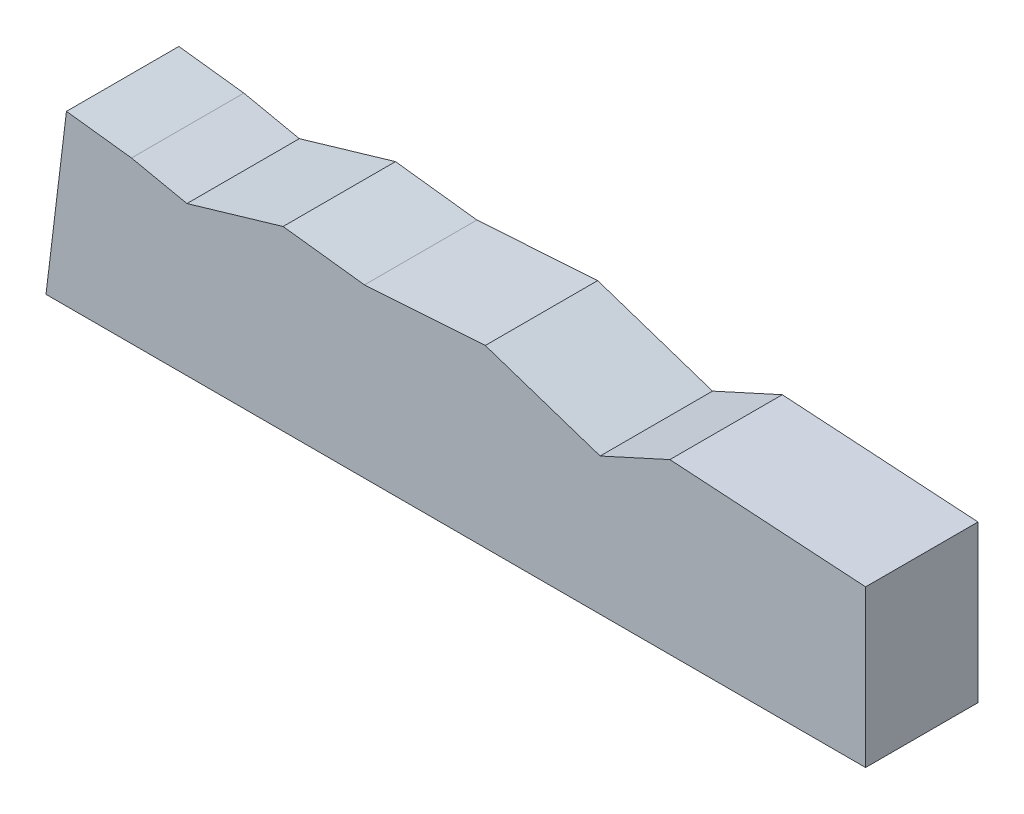
ISO-10303-21;
HEADER;
FILE_DESCRIPTION(('STEP AP214'),'2;1');
FILE_NAME('part.step','',(''),(''),'','','');
FILE_SCHEMA(('AUTOMOTIVE_DESIGN { 1 0 10303 214 1 1 1 1 }'));
ENDSEC;
DATA;
#1=APPLICATION_CONTEXT('core data for automotive mechanical design processes');
#2=APPLICATION_PROTOCOL_DEFINITION('international standard','automotive_design',2000,#1);
#3=PRODUCT_CONTEXT('',#1,'mechanical');
#4=PRODUCT('Part','Part','',(#3));
#5=PRODUCT_RELATED_PRODUCT_CATEGORY('part','',(#4));
#6=PRODUCT_DEFINITION_FORMATION('','',#4);
#7=PRODUCT_DEFINITION_CONTEXT('part definition',#1,'design');
#8=PRODUCT_DEFINITION('design','',#6,#7);
#9=PRODUCT_DEFINITION_SHAPE('','',#8);
#10=(LENGTH_UNIT() NAMED_UNIT(*) SI_UNIT(.MILLI.,.METRE.));
#11=(NAMED_UNIT(*) PLANE_ANGLE_UNIT() SI_UNIT($,.RADIAN.));
#12=(NAMED_UNIT(*) SI_UNIT($,.STERADIAN.) SOLID_ANGLE_UNIT());
#13=UNCERTAINTY_MEASURE_WITH_UNIT(LENGTH_MEASURE(1.E-05),#10,'distance_accuracy_value','');
#14=(GEOMETRIC_REPRESENTATION_CONTEXT(3) GLOBAL_UNCERTAINTY_ASSIGNED_CONTEXT((#13)) GLOBAL_UNIT_ASSIGNED_CONTEXT((#10,
#11,#12)) REPRESENTATION_CONTEXT('',''));
#15=CARTESIAN_POINT('',(0.,0.,0.));
#16=DIRECTION('',(0.,0.,1.));
#17=DIRECTION('',(1.,0.,0.));
#18=AXIS2_PLACEMENT_3D('',#15,#16,#17);
#19=CARTESIAN_POINT('',(174.222136921618,-126.856784040929,25.));
#20=DIRECTION('',(-1.,0.,0.));
#21=DIRECTION('',(0.,0.,1.));
#22=AXIS2_PLACEMENT_3D('',#19,#20,#21);
#23=PLANE('',#22);
#24=DIRECTION('',(0.,1.,0.));
#25=VECTOR('',#24,1.);
#26=CARTESIAN_POINT('',(174.222136921618,-126.856784040929,-25.));
#27=LINE('',#26,#25);
#28=CARTESIAN_POINT('',(174.222136921618,-126.856784040929,-25.));
#29=VERTEX_POINT('',#28);
#30=CARTESIAN_POINT('',(174.222136921618,-57.2381283717194,-25.));
#31=VERTEX_POINT('',#30);
#32=EDGE_CURVE('E151',#29,#31,#27,.T.);
#33=ORIENTED_EDGE('',*,*,#32,.T.);
#34=DIRECTION('',(0.,0.,-1.));
#35=VECTOR('',#34,1.);
#36=CARTESIAN_POINT('',(174.222136921618,-57.2381283717194,25.));
#37=LINE('',#36,#35);
#38=CARTESIAN_POINT('',(174.222136921618,-57.2381283717194,25.));
#39=VERTEX_POINT('',#38);
#40=EDGE_CURVE('E11',#39,#31,#37,.T.);
#41=ORIENTED_EDGE('',*,*,#40,.F.);
#42=DIRECTION('',(0.,1.,0.));
#43=VECTOR('',#42,1.);
#44=CARTESIAN_POINT('',(174.222136921618,-126.856784040929,25.));
#45=LINE('',#44,#43);
#46=CARTESIAN_POINT('',(174.222136921618,-126.856784040929,25.));
#47=VERTEX_POINT('',#46);
#48=EDGE_CURVE('E171',#47,#39,#45,.T.);
#49=ORIENTED_EDGE('',*,*,#48,.F.);
#50=DIRECTION('',(0.,0.,-1.));
#51=VECTOR('',#50,1.);
#52=CARTESIAN_POINT('',(174.222136921618,-126.856784040929,25.));
#53=LINE('',#52,#51);
#54=EDGE_CURVE('E147',#47,#29,#53,.T.);
#55=ORIENTED_EDGE('',*,*,#54,.T.);
#56=EDGE_LOOP('',(#33,#41,#49,#55));
#57=FACE_BOUND('',#56,.T.);
#58=ADVANCED_FACE('F37',(#57),#23,.F.);
#59=CARTESIAN_POINT('',(174.222136921618,-57.2381283717194,25.));
#60=DIRECTION('',(-0.062997541398777,-0.998013682159573,0.));
#61=DIRECTION('',(0.998013682159573,-0.062997541398777,0.));
#62=AXIS2_PLACEMENT_3D('',#59,#60,#61);
#63=PLANE('',#62);
#64=DIRECTION('',(-0.998013682159573,0.062997541398777,0.));
#65=VECTOR('',#64,1.);
#66=CARTESIAN_POINT('',(174.222136921618,-57.2381283717194,-25.));
#67=LINE('',#66,#65);
#68=CARTESIAN_POINT('',(87.1568381803844,-51.7423121721066,-25.));
#69=VERTEX_POINT('',#68);
#70=EDGE_CURVE('E154',#31,#69,#67,.T.);
#71=ORIENTED_EDGE('',*,*,#70,.T.);
#72=DIRECTION('',(0.,0.,-1.));
#73=VECTOR('',#72,1.);
#74=CARTESIAN_POINT('',(87.1568381803844,-51.7423121721066,25.));
#75=LINE('',#74,#73);
#76=CARTESIAN_POINT('',(87.1568381803844,-51.7423121721066,25.));
#77=VERTEX_POINT('',#76);
#78=EDGE_CURVE('E45',#77,#69,#75,.T.);
#79=ORIENTED_EDGE('',*,*,#78,.F.);
#80=DIRECTION('',(-0.998013682159573,0.062997541398777,0.));
#81=VECTOR('',#80,1.);
#82=CARTESIAN_POINT('',(174.222136921618,-57.2381283717194,25.));
#83=LINE('',#82,#81);
#84=EDGE_CURVE('E105',#39,#77,#83,.T.);
#85=ORIENTED_EDGE('',*,*,#84,.F.);
#86=ORIENTED_EDGE('',*,*,#40,.T.);
#87=EDGE_LOOP('',(#71,#79,#85,#86));
#88=FACE_BOUND('',#87,.T.);
#89=ADVANCED_FACE('F243',(#88),#63,.F.);
#90=CARTESIAN_POINT('',(87.1568381803844,-51.7423121721066,25.));
#91=DIRECTION('',(0.414481700405183,-0.910057646541816,0.));
#92=DIRECTION('',(0.910057646541816,0.414481700405183,0.));
#93=AXIS2_PLACEMENT_3D('',#90,#91,#92);
#94=PLANE('',#93);
#95=DIRECTION('',(-0.910057646541816,-0.414481700405183,0.));
#96=VECTOR('',#95,1.);
#97=CARTESIAN_POINT('',(87.1568381803844,-51.7423121721066,-25.));
#98=LINE('',#97,#96);
#99=CARTESIAN_POINT('',(56.1352863683343,-65.87093973007,-25.));
#100=VERTEX_POINT('',#99);
#101=EDGE_CURVE('E156',#69,#100,#98,.T.);
#102=ORIENTED_EDGE('',*,*,#101,.T.);
#103=DIRECTION('',(0.,0.,-1.));
#104=VECTOR('',#103,1.);
#105=CARTESIAN_POINT('',(56.1352863683343,-65.87093973007,25.));
#106=LINE('',#105,#104);
#107=CARTESIAN_POINT('',(56.1352863683343,-65.87093973007,25.));
#108=VERTEX_POINT('',#107);
#109=EDGE_CURVE('E187',#108,#100,#106,.T.);
#110=ORIENTED_EDGE('',*,*,#109,.F.);
#111=DIRECTION('',(-0.910057646541816,-0.414481700405183,0.));
#112=VECTOR('',#111,1.);
#113=CARTESIAN_POINT('',(87.1568381803844,-51.7423121721066,25.));
#114=LINE('',#113,#112);
#115=EDGE_CURVE('E195',#77,#108,#114,.T.);
#116=ORIENTED_EDGE('',*,*,#115,.F.);
#117=ORIENTED_EDGE('',*,*,#78,.T.);
#118=EDGE_LOOP('',(#102,#110,#116,#117));
#119=FACE_BOUND('',#118,.T.);
#120=ADVANCED_FACE('F193',(#119),#94,.F.);
#121=CARTESIAN_POINT('',(56.1352863683343,-65.87093973007,25.));
#122=DIRECTION('',(-0.316227766016838,-0.948683298050514,0.));
#123=DIRECTION('',(0.948683298050514,-0.316227766016838,0.));
#124=AXIS2_PLACEMENT_3D('',#121,#122,#123);
#125=PLANE('',#124);
#126=DIRECTION('',(-0.948683298050514,0.316227766016838,0.));
#127=VECTOR('',#126,1.);
#128=CARTESIAN_POINT('',(56.1352863683343,-65.87093973007,-25.));
#129=LINE('',#128,#127);
#130=CARTESIAN_POINT('',(5.04231824238954,-48.8399503547551,-25.));
#131=VERTEX_POINT('',#130);
#132=EDGE_CURVE('E158',#100,#131,#129,.T.);
#133=ORIENTED_EDGE('',*,*,#132,.T.);
#134=DIRECTION('',(0.,0.,-1.));
#135=VECTOR('',#134,1.);
#136=CARTESIAN_POINT('',(5.04231824238954,-48.8399503547551,25.));
#137=LINE('',#136,#135);
#138=CARTESIAN_POINT('',(5.04231824238954,-48.8399503547551,25.));
#139=VERTEX_POINT('',#138);
#140=EDGE_CURVE('E184',#139,#131,#137,.T.);
#141=ORIENTED_EDGE('',*,*,#140,.F.);
#142=DIRECTION('',(-0.948683298050514,0.316227766016838,0.));
#143=VECTOR('',#142,1.);
#144=CARTESIAN_POINT('',(56.1352863683343,-65.87093973007,25.));
#145=LINE('',#144,#143);
#146=EDGE_CURVE('E213',#108,#139,#145,.T.);
#147=ORIENTED_EDGE('',*,*,#146,.F.);
#148=ORIENTED_EDGE('',*,*,#109,.T.);
#149=EDGE_LOOP('',(#133,#141,#147,#148));
#150=FACE_BOUND('',#149,.T.);
#151=ADVANCED_FACE('F204',(#150),#125,.F.);
#152=CARTESIAN_POINT('',(5.04231824238954,-48.8399503547551,25.));
#153=DIRECTION('',(0.0654332425606763,-0.997856949050311,0.));
#154=DIRECTION('',(0.997856949050311,0.0654332425606763,0.));
#155=AXIS2_PLACEMENT_3D('',#152,#153,#154);
#156=PLANE('',#155);
#157=DIRECTION('',(-0.997856949050311,-0.0654332425606763,0.));
#158=VECTOR('',#157,1.);
#159=CARTESIAN_POINT('',(5.04231824238954,-48.8399503547551,-25.));
#160=LINE('',#159,#158);
#161=CARTESIAN_POINT('',(-48.6933896142075,-52.3636033289582,-25.));
#162=VERTEX_POINT('',#161);
#163=EDGE_CURVE('E160',#131,#162,#160,.T.);
#164=ORIENTED_EDGE('',*,*,#163,.T.);
#165=DIRECTION('',(0.,0.,-1.));
#166=VECTOR('',#165,1.);
#167=CARTESIAN_POINT('',(-48.6933896142075,-52.3636033289582,25.));
#168=LINE('',#167,#166);
#169=CARTESIAN_POINT('',(-48.6933896142075,-52.3636033289582,25.));
#170=VERTEX_POINT('',#169);
#171=EDGE_CURVE('E181',#170,#162,#168,.T.);
#172=ORIENTED_EDGE('',*,*,#171,.F.);
#173=DIRECTION('',(-0.997856949050311,-0.0654332425606763,0.));
#174=VECTOR('',#173,1.);
#175=CARTESIAN_POINT('',(5.04231824238954,-48.8399503547551,25.));
#176=LINE('',#175,#174);
#177=EDGE_CURVE('E210',#139,#170,#176,.T.);
#178=ORIENTED_EDGE('',*,*,#177,.F.);
#179=ORIENTED_EDGE('',*,*,#140,.T.);
#180=EDGE_LOOP('',(#164,#172,#178,#179));
#181=FACE_BOUND('',#180,.T.);
#182=ADVANCED_FACE('F208',(#181),#156,.F.);
#183=CARTESIAN_POINT('',(-48.6933896142075,-52.3636033289582,25.));
#184=DIRECTION('',(-0.120331367519238,-0.992733782033708,0.));
#185=DIRECTION('',(0.992733782033708,-0.120331367519238,0.));
#186=AXIS2_PLACEMENT_3D('',#183,#184,#185);
#187=PLANE('',#186);
#188=DIRECTION('',(-0.992733782033708,0.120331367519238,0.));
#189=VECTOR('',#188,1.);
#190=CARTESIAN_POINT('',(-48.6933896142075,-52.3636033289582,-25.));
#191=LINE('',#190,#189);
#192=CARTESIAN_POINT('',(-84.9091169106755,-47.9738182021136,-25.));
#193=VERTEX_POINT('',#192);
#194=EDGE_CURVE('E162',#162,#193,#191,.T.);
#195=ORIENTED_EDGE('',*,*,#194,.T.);
#196=DIRECTION('',(0.,0.,-1.));
#197=VECTOR('',#196,1.);
#198=CARTESIAN_POINT('',(-84.9091169106755,-47.9738182021136,25.));
#199=LINE('',#198,#197);
#200=CARTESIAN_POINT('',(-84.9091169106755,-47.9738182021136,25.));
#201=VERTEX_POINT('',#200);
#202=EDGE_CURVE('E178',#201,#193,#199,.T.);
#203=ORIENTED_EDGE('',*,*,#202,.F.);
#204=DIRECTION('',(-0.992733782033708,0.120331367519238,0.));
#205=VECTOR('',#204,1.);
#206=CARTESIAN_POINT('',(-48.6933896142075,-52.3636033289582,25.));
#207=LINE('',#206,#205);
#208=EDGE_CURVE('E212',#170,#201,#207,.T.);
#209=ORIENTED_EDGE('',*,*,#208,.F.);
#210=ORIENTED_EDGE('',*,*,#171,.T.);
#211=EDGE_LOOP('',(#195,#203,#209,#210));
#212=FACE_BOUND('',#211,.T.);
#213=ADVANCED_FACE('F256',(#212),#187,.F.);
#214=CARTESIAN_POINT('',(-84.9091169106755,-47.9738182021136,25.));
#215=DIRECTION('',(0.281473567950709,-0.959568981650146,0.));
#216=DIRECTION('',(0.959568981650146,0.281473567950709,0.));
#217=AXIS2_PLACEMENT_3D('',#214,#215,#216);
#218=PLANE('',#217);
#219=DIRECTION('',(-0.959568981650146,-0.281473567950709,0.));
#220=VECTOR('',#219,1.);
#221=CARTESIAN_POINT('',(-84.9091169106755,-47.9738182021136,-25.));
#222=LINE('',#221,#220);
#223=CARTESIAN_POINT('',(-127.67636539161,-60.5188777565209,-25.));
#224=VERTEX_POINT('',#223);
#225=EDGE_CURVE('E164',#193,#224,#222,.T.);
#226=ORIENTED_EDGE('',*,*,#225,.T.);
#227=DIRECTION('',(0.,0.,-1.));
#228=VECTOR('',#227,1.);
#229=CARTESIAN_POINT('',(-127.67636539161,-60.5188777565209,25.));
#230=LINE('',#229,#228);
#231=CARTESIAN_POINT('',(-127.67636539161,-60.5188777565209,25.));
#232=VERTEX_POINT('',#231);
#233=EDGE_CURVE('E175',#232,#224,#230,.T.);
#234=ORIENTED_EDGE('',*,*,#233,.F.);
#235=DIRECTION('',(-0.959568981650146,-0.281473567950709,0.));
#236=VECTOR('',#235,1.);
#237=CARTESIAN_POINT('',(-84.9091169106755,-47.9738182021136,25.));
#238=LINE('',#237,#236);
#239=EDGE_CURVE('E215',#201,#232,#238,.T.);
#240=ORIENTED_EDGE('',*,*,#239,.F.);
#241=ORIENTED_EDGE('',*,*,#202,.T.);
#242=EDGE_LOOP('',(#226,#234,#240,#241));
#243=FACE_BOUND('',#242,.T.);
#244=ADVANCED_FACE('F224',(#243),#218,.F.);
#245=CARTESIAN_POINT('',(-127.67636539161,-60.5188777565209,25.));
#246=DIRECTION('',(-0.206958591044391,-0.978349703118941,0.));
#247=DIRECTION('',(0.978349703118941,-0.206958591044391,0.));
#248=AXIS2_PLACEMENT_3D('',#245,#246,#247);
#249=PLANE('',#248);
#250=DIRECTION('',(-0.978349703118941,0.206958591044391,0.));
#251=VECTOR('',#250,1.);
#252=CARTESIAN_POINT('',(-127.67636539161,-60.5188777565209,-25.));
#253=LINE('',#252,#251);
#254=CARTESIAN_POINT('',(-152.347514605348,-55.2999808074608,-25.));
#255=VERTEX_POINT('',#254);
#256=EDGE_CURVE('E166',#224,#255,#253,.T.);
#257=ORIENTED_EDGE('',*,*,#256,.T.);
#258=DIRECTION('',(0.,0.,-1.));
#259=VECTOR('',#258,1.);
#260=CARTESIAN_POINT('',(-152.347514605348,-55.2999808074608,25.));
#261=LINE('',#260,#259);
#262=CARTESIAN_POINT('',(-152.347514605348,-55.2999808074608,25.));
#263=VERTEX_POINT('',#262);
#264=EDGE_CURVE('E142',#263,#255,#261,.T.);
#265=ORIENTED_EDGE('',*,*,#264,.F.);
#266=DIRECTION('',(-0.978349703118941,0.206958591044391,0.));
#267=VECTOR('',#266,1.);
#268=CARTESIAN_POINT('',(-127.67636539161,-60.5188777565209,25.));
#269=LINE('',#268,#267);
#270=EDGE_CURVE('E133',#232,#263,#269,.T.);
#271=ORIENTED_EDGE('',*,*,#270,.F.);
#272=ORIENTED_EDGE('',*,*,#233,.T.);
#273=EDGE_LOOP('',(#257,#265,#271,#272));
#274=FACE_BOUND('',#273,.T.);
#275=ADVANCED_FACE('F228',(#274),#249,.F.);
#276=CARTESIAN_POINT('',(-152.347514605348,-55.2999808074608,25.));
#277=DIRECTION('',(-0.120331367519238,-0.992733782033708,0.));
#278=DIRECTION('',(0.992733782033708,-0.120331367519238,0.));
#279=AXIS2_PLACEMENT_3D('',#276,#277,#278);
#280=PLANE('',#279);
#281=DIRECTION('',(-0.992733782033708,0.120331367519238,0.));
#282=VECTOR('',#281,1.);
#283=CARTESIAN_POINT('',(-152.347514605348,-55.2999808074608,-25.));
#284=LINE('',#283,#282);
#285=CARTESIAN_POINT('',(-181.2773432888,-51.7933349064363,-25.));
#286=VERTEX_POINT('',#285);
#287=EDGE_CURVE('E141',#255,#286,#284,.T.);
#288=ORIENTED_EDGE('',*,*,#287,.T.);
#289=DIRECTION('',(0.,0.,-1.));
#290=VECTOR('',#289,1.);
#291=CARTESIAN_POINT('',(-181.2773432888,-51.7933349064363,25.));
#292=LINE('',#291,#290);
#293=CARTESIAN_POINT('',(-181.2773432888,-51.7933349064363,25.));
#294=VERTEX_POINT('',#293);
#295=EDGE_CURVE('E138',#294,#286,#292,.T.);
#296=ORIENTED_EDGE('',*,*,#295,.F.);
#297=DIRECTION('',(-0.992733782033708,0.120331367519238,0.));
#298=VECTOR('',#297,1.);
#299=CARTESIAN_POINT('',(-152.347514605348,-55.2999808074608,25.));
#300=LINE('',#299,#298);
#301=EDGE_CURVE('E127',#263,#294,#300,.T.);
#302=ORIENTED_EDGE('',*,*,#301,.F.);
#303=ORIENTED_EDGE('',*,*,#264,.T.);
#304=EDGE_LOOP('',(#288,#296,#302,#303));
#305=FACE_BOUND('',#304,.T.);
#306=ADVANCED_FACE('F139',(#305),#280,.F.);
#307=CARTESIAN_POINT('',(-181.2773432888,-51.7933349064363,25.));
#308=DIRECTION('',(0.992733782033708,-0.120331367519238,0.));
#309=DIRECTION('',(0.120331367519238,0.992733782033708,0.));
#310=AXIS2_PLACEMENT_3D('',#307,#308,#309);
#311=PLANE('',#310);
#312=DIRECTION('',(-0.120331367519238,-0.992733782033708,0.));
#313=VECTOR('',#312,1.);
#314=CARTESIAN_POINT('',(-181.2773432888,-51.7933349064363,-25.));
#315=LINE('',#314,#313);
#316=CARTESIAN_POINT('',(-190.37594318389,-126.856784040929,-25.));
#317=VERTEX_POINT('',#316);
#318=EDGE_CURVE('E91',#286,#317,#315,.T.);
#319=ORIENTED_EDGE('',*,*,#318,.T.);
#320=DIRECTION('',(0.,0.,-1.));
#321=VECTOR('',#320,1.);
#322=CARTESIAN_POINT('',(-190.37594318389,-126.856784040929,25.));
#323=LINE('',#322,#321);
#324=CARTESIAN_POINT('',(-190.37594318389,-126.856784040929,25.));
#325=VERTEX_POINT('',#324);
#326=EDGE_CURVE('E143',#325,#317,#323,.T.);
#327=ORIENTED_EDGE('',*,*,#326,.F.);
#328=DIRECTION('',(-0.120331367519238,-0.992733782033708,0.));
#329=VECTOR('',#328,1.);
#330=CARTESIAN_POINT('',(-181.2773432888,-51.7933349064363,25.));
#331=LINE('',#330,#329);
#332=EDGE_CURVE('E131',#294,#325,#331,.T.);
#333=ORIENTED_EDGE('',*,*,#332,.F.);
#334=ORIENTED_EDGE('',*,*,#295,.T.);
#335=EDGE_LOOP('',(#319,#327,#333,#334));
#336=FACE_BOUND('',#335,.T.);
#337=ADVANCED_FACE('F145',(#336),#311,.F.);
#338=CARTESIAN_POINT('',(-190.37594318389,-126.856784040929,25.));
#339=DIRECTION('',(0.,1.,0.));
#340=DIRECTION('',(0.,0.,1.));
#341=AXIS2_PLACEMENT_3D('',#338,#339,#340);
#342=PLANE('',#341);
#343=DIRECTION('',(1.,0.,0.));
#344=VECTOR('',#343,1.);
#345=CARTESIAN_POINT('',(-190.37594318389,-126.856784040929,-25.));
#346=LINE('',#345,#344);
#347=EDGE_CURVE('E97',#317,#29,#346,.T.);
#348=ORIENTED_EDGE('',*,*,#347,.T.);
#349=ORIENTED_EDGE('',*,*,#54,.F.);
#350=DIRECTION('',(1.,0.,0.));
#351=VECTOR('',#350,1.);
#352=CARTESIAN_POINT('',(-190.37594318389,-126.856784040929,25.));
#353=LINE('',#352,#351);
#354=EDGE_CURVE('E53',#325,#47,#353,.T.);
#355=ORIENTED_EDGE('',*,*,#354,.F.);
#356=ORIENTED_EDGE('',*,*,#326,.T.);
#357=EDGE_LOOP('',(#348,#349,#355,#356));
#358=FACE_BOUND('',#357,.T.);
#359=ADVANCED_FACE('F232',(#358),#342,.F.);
#360=CARTESIAN_POINT('',(0.,0.,25.));
#361=DIRECTION('',(0.,0.,-1.));
#362=DIRECTION('',(-1.,0.,0.));
#363=AXIS2_PLACEMENT_3D('',#360,#361,#362);
#364=PLANE('',#363);
#365=ORIENTED_EDGE('',*,*,#48,.T.);
#366=ORIENTED_EDGE('',*,*,#84,.T.);
#367=ORIENTED_EDGE('',*,*,#115,.T.);
#368=ORIENTED_EDGE('',*,*,#146,.T.);
#369=ORIENTED_EDGE('',*,*,#177,.T.);
#370=ORIENTED_EDGE('',*,*,#208,.T.);
#371=ORIENTED_EDGE('',*,*,#239,.T.);
#372=ORIENTED_EDGE('',*,*,#270,.T.);
#373=ORIENTED_EDGE('',*,*,#301,.T.);
#374=ORIENTED_EDGE('',*,*,#332,.T.);
#375=ORIENTED_EDGE('',*,*,#354,.T.);
#376=EDGE_LOOP('',(#365,#366,#367,#368,#369,#370,#371,#372,#373,#374,#375));
#377=FACE_BOUND('',#376,.T.);
#378=ADVANCED_FACE('F129',(#377),#364,.F.);
#379=CARTESIAN_POINT('',(0.,0.,-25.));
#380=DIRECTION('',(0.,0.,-1.));
#381=DIRECTION('',(-1.,0.,0.));
#382=AXIS2_PLACEMENT_3D('',#379,#380,#381);
#383=PLANE('',#382);
#384=ORIENTED_EDGE('',*,*,#32,.F.);
#385=ORIENTED_EDGE('',*,*,#347,.F.);
#386=ORIENTED_EDGE('',*,*,#318,.F.);
#387=ORIENTED_EDGE('',*,*,#287,.F.);
#388=ORIENTED_EDGE('',*,*,#256,.F.);
#389=ORIENTED_EDGE('',*,*,#225,.F.);
#390=ORIENTED_EDGE('',*,*,#194,.F.);
#391=ORIENTED_EDGE('',*,*,#163,.F.);
#392=ORIENTED_EDGE('',*,*,#132,.F.);
#393=ORIENTED_EDGE('',*,*,#101,.F.);
#394=ORIENTED_EDGE('',*,*,#70,.F.);
#395=EDGE_LOOP('',(#384,#385,#386,#387,#388,#389,#390,#391,#392,#393,#394));
#396=FACE_BOUND('',#395,.T.);
#397=ADVANCED_FACE('F199',(#396),#383,.T.);
#398=CLOSED_SHELL('',(#58,#89,#120,#151,#182,#213,#244,#275,#306,#337,#359,#378,#397));
#399=MANIFOLD_SOLID_BREP('B2',#398);
#400=ADVANCED_BREP_SHAPE_REPRESENTATION('',(#18,#399),#14);
#401=SHAPE_DEFINITION_REPRESENTATION(#9,#400);
ENDSEC;
END-ISO-10303-21;
